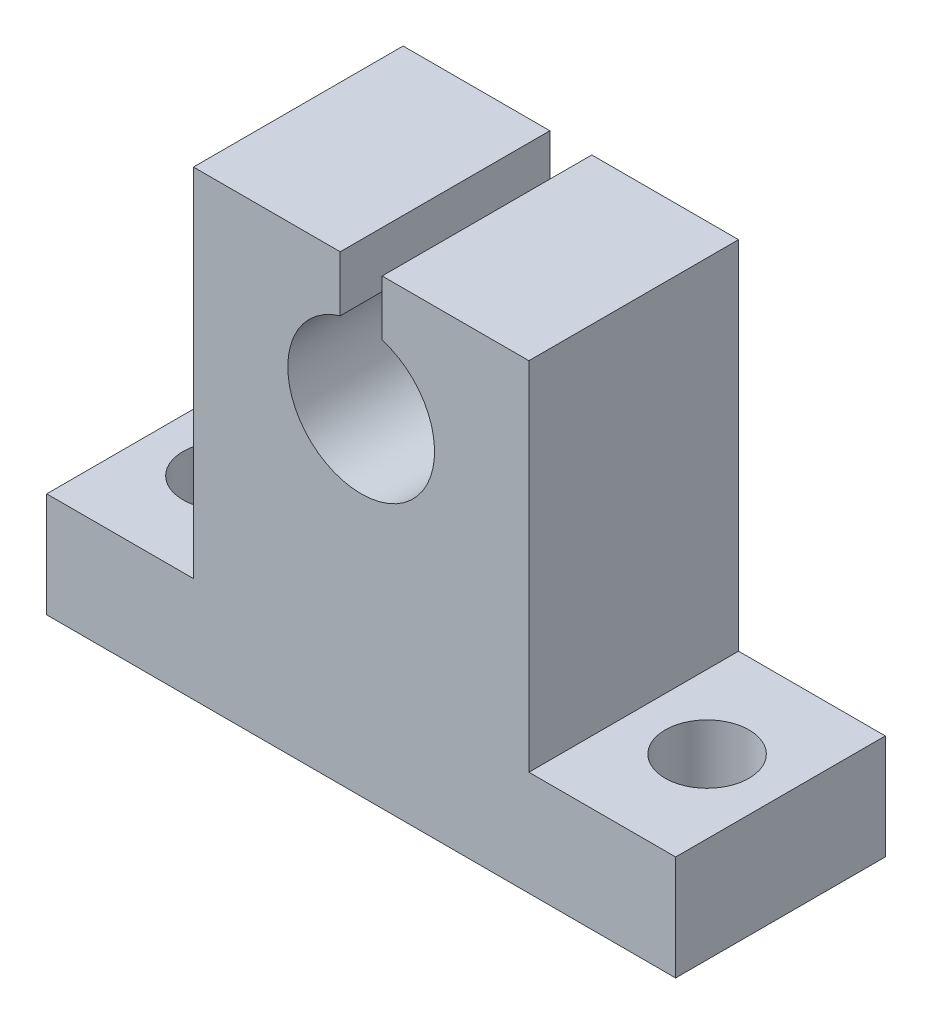
ISO-10303-21;
HEADER;
FILE_DESCRIPTION(('STEP AP214'),'2;1');
FILE_NAME('part.step','',(''),(''),'','','');
FILE_SCHEMA(('AUTOMOTIVE_DESIGN { 1 0 10303 214 1 1 1 1 }'));
ENDSEC;
DATA;
#1=APPLICATION_CONTEXT('core data for automotive mechanical design processes');
#2=APPLICATION_PROTOCOL_DEFINITION('international standard','automotive_design',2000,#1);
#3=PRODUCT_CONTEXT('',#1,'mechanical');
#4=PRODUCT('Part','Part','',(#3));
#5=PRODUCT_RELATED_PRODUCT_CATEGORY('part','',(#4));
#6=PRODUCT_DEFINITION_FORMATION('','',#4);
#7=PRODUCT_DEFINITION_CONTEXT('part definition',#1,'design');
#8=PRODUCT_DEFINITION('design','',#6,#7);
#9=PRODUCT_DEFINITION_SHAPE('','',#8);
#10=(LENGTH_UNIT() NAMED_UNIT(*) SI_UNIT(.MILLI.,.METRE.));
#11=(NAMED_UNIT(*) PLANE_ANGLE_UNIT() SI_UNIT($,.RADIAN.));
#12=(NAMED_UNIT(*) SI_UNIT($,.STERADIAN.) SOLID_ANGLE_UNIT());
#13=UNCERTAINTY_MEASURE_WITH_UNIT(LENGTH_MEASURE(1.E-05),#10,'distance_accuracy_value','');
#14=(GEOMETRIC_REPRESENTATION_CONTEXT(3) GLOBAL_UNCERTAINTY_ASSIGNED_CONTEXT((#13)) GLOBAL_UNIT_ASSIGNED_CONTEXT((#10,
#11,#12)) REPRESENTATION_CONTEXT('',''));
#15=CARTESIAN_POINT('',(0.,0.,0.));
#16=DIRECTION('',(0.,0.,1.));
#17=DIRECTION('',(1.,0.,0.));
#18=AXIS2_PLACEMENT_3D('',#15,#16,#17);
#19=CARTESIAN_POINT('',(-15.,5.,10.));
#20=DIRECTION('',(1.,0.,0.));
#21=DIRECTION('',(0.,0.,-1.));
#22=AXIS2_PLACEMENT_3D('',#19,#20,#21);
#23=PLANE('',#22);
#24=DIRECTION('',(0.,-1.,0.));
#25=VECTOR('',#24,1.);
#26=CARTESIAN_POINT('',(-15.,5.,0.));
#27=LINE('',#26,#25);
#28=CARTESIAN_POINT('',(-15.,5.,0.));
#29=VERTEX_POINT('',#28);
#30=CARTESIAN_POINT('',(-15.,0.,0.));
#31=VERTEX_POINT('',#30);
#32=EDGE_CURVE('E153',#29,#31,#27,.T.);
#33=ORIENTED_EDGE('',*,*,#32,.T.);
#34=DIRECTION('',(0.,0.,-1.));
#35=VECTOR('',#34,1.);
#36=CARTESIAN_POINT('',(-15.,0.,10.));
#37=LINE('',#36,#35);
#38=CARTESIAN_POINT('',(-15.,0.,10.));
#39=VERTEX_POINT('',#38);
#40=EDGE_CURVE('E11',#39,#31,#37,.T.);
#41=ORIENTED_EDGE('',*,*,#40,.F.);
#42=DIRECTION('',(0.,-1.,0.));
#43=VECTOR('',#42,1.);
#44=CARTESIAN_POINT('',(-15.,5.,10.));
#45=LINE('',#44,#43);
#46=CARTESIAN_POINT('',(-15.,5.,10.));
#47=VERTEX_POINT('',#46);
#48=EDGE_CURVE('E176',#47,#39,#45,.T.);
#49=ORIENTED_EDGE('',*,*,#48,.F.);
#50=DIRECTION('',(0.,0.,-1.));
#51=VECTOR('',#50,1.);
#52=CARTESIAN_POINT('',(-15.,5.,10.));
#53=LINE('',#52,#51);
#54=EDGE_CURVE('E149',#47,#29,#53,.T.);
#55=ORIENTED_EDGE('',*,*,#54,.T.);
#56=EDGE_LOOP('',(#33,#41,#49,#55));
#57=FACE_BOUND('',#56,.T.);
#58=ADVANCED_FACE('F33',(#57),#23,.F.);
#59=CARTESIAN_POINT('',(-15.,0.,10.));
#60=DIRECTION('',(0.,1.,0.));
#61=DIRECTION('',(-1.,0.,0.));
#62=AXIS2_PLACEMENT_3D('',#59,#60,#61);
#63=PLANE('',#62);
#64=CARTESIAN_POINT('',(11.5,0.,5.));
#65=DIRECTION('',(0.,1.,0.));
#66=DIRECTION('',(-1.,0.,0.));
#67=AXIS2_PLACEMENT_3D('',#64,#65,#66);
#68=CIRCLE('',#67,2.);
#69=CARTESIAN_POINT('',(9.5,0.,5.));
#70=VERTEX_POINT('',#69);
#71=EDGE_CURVE('E157',#70,#70,#68,.T.);
#72=ORIENTED_EDGE('',*,*,#71,.T.);
#73=EDGE_LOOP('',(#72));
#74=FACE_BOUND('',#73,.T.);
#75=CARTESIAN_POINT('',(-11.5,0.,5.));
#76=DIRECTION('',(0.,1.,0.));
#77=DIRECTION('',(1.,0.,0.));
#78=AXIS2_PLACEMENT_3D('',#75,#76,#77);
#79=CIRCLE('',#78,2.);
#80=CARTESIAN_POINT('',(-9.5,0.,5.));
#81=VERTEX_POINT('',#80);
#82=EDGE_CURVE('E353',#81,#81,#79,.T.);
#83=ORIENTED_EDGE('',*,*,#82,.T.);
#84=EDGE_LOOP('',(#83));
#85=FACE_BOUND('',#84,.T.);
#86=DIRECTION('',(1.,0.,0.));
#87=VECTOR('',#86,1.);
#88=CARTESIAN_POINT('',(-15.,0.,0.));
#89=LINE('',#88,#87);
#90=CARTESIAN_POINT('',(15.,0.,0.));
#91=VERTEX_POINT('',#90);
#92=EDGE_CURVE('E156',#31,#91,#89,.T.);
#93=ORIENTED_EDGE('',*,*,#92,.T.);
#94=DIRECTION('',(0.,0.,-1.));
#95=VECTOR('',#94,1.);
#96=CARTESIAN_POINT('',(15.,0.,10.));
#97=LINE('',#96,#95);
#98=CARTESIAN_POINT('',(15.,0.,10.));
#99=VERTEX_POINT('',#98);
#100=EDGE_CURVE('E41',#99,#91,#97,.T.);
#101=ORIENTED_EDGE('',*,*,#100,.F.);
#102=DIRECTION('',(1.,0.,0.));
#103=VECTOR('',#102,1.);
#104=CARTESIAN_POINT('',(-15.,0.,10.));
#105=LINE('',#104,#103);
#106=EDGE_CURVE('E104',#39,#99,#105,.T.);
#107=ORIENTED_EDGE('',*,*,#106,.F.);
#108=ORIENTED_EDGE('',*,*,#40,.T.);
#109=EDGE_LOOP('',(#93,#101,#107,#108));
#110=FACE_BOUND('',#109,.T.);
#111=ADVANCED_FACE('F256',(#74,#85,#110),#63,.F.);
#112=CARTESIAN_POINT('',(15.,0.,10.));
#113=DIRECTION('',(-1.,0.,0.));
#114=DIRECTION('',(0.,-1.,0.));
#115=AXIS2_PLACEMENT_3D('',#112,#113,#114);
#116=PLANE('',#115);
#117=DIRECTION('',(0.,1.,0.));
#118=VECTOR('',#117,1.);
#119=CARTESIAN_POINT('',(15.,0.,0.));
#120=LINE('',#119,#118);
#121=CARTESIAN_POINT('',(15.,5.00000000000001,0.));
#122=VERTEX_POINT('',#121);
#123=EDGE_CURVE('E159',#91,#122,#120,.T.);
#124=ORIENTED_EDGE('',*,*,#123,.T.);
#125=DIRECTION('',(0.,0.,-1.));
#126=VECTOR('',#125,1.);
#127=CARTESIAN_POINT('',(15.,5.00000000000001,10.));
#128=LINE('',#127,#126);
#129=CARTESIAN_POINT('',(15.,5.00000000000001,10.));
#130=VERTEX_POINT('',#129);
#131=EDGE_CURVE('E195',#130,#122,#128,.T.);
#132=ORIENTED_EDGE('',*,*,#131,.F.);
#133=DIRECTION('',(0.,1.,0.));
#134=VECTOR('',#133,1.);
#135=CARTESIAN_POINT('',(15.,0.,10.));
#136=LINE('',#135,#134);
#137=EDGE_CURVE('E203',#99,#130,#136,.T.);
#138=ORIENTED_EDGE('',*,*,#137,.F.);
#139=ORIENTED_EDGE('',*,*,#100,.T.);
#140=EDGE_LOOP('',(#124,#132,#138,#139));
#141=FACE_BOUND('',#140,.T.);
#142=ADVANCED_FACE('F201',(#141),#116,.F.);
#143=CARTESIAN_POINT('',(15.,5.00000000000001,10.));
#144=DIRECTION('',(0.,-1.,0.));
#145=DIRECTION('',(1.,0.,0.));
#146=AXIS2_PLACEMENT_3D('',#143,#144,#145);
#147=PLANE('',#146);
#148=CARTESIAN_POINT('',(11.5,5.00000000000001,5.));
#149=DIRECTION('',(0.,1.,0.));
#150=DIRECTION('',(-1.,0.,0.));
#151=AXIS2_PLACEMENT_3D('',#148,#149,#150);
#152=CIRCLE('',#151,2.);
#153=CARTESIAN_POINT('',(9.5,5.00000000000001,5.));
#154=VERTEX_POINT('',#153);
#155=EDGE_CURVE('E352',#154,#154,#152,.T.);
#156=ORIENTED_EDGE('',*,*,#155,.F.);
#157=EDGE_LOOP('',(#156));
#158=FACE_BOUND('',#157,.T.);
#159=DIRECTION('',(-1.,0.,0.));
#160=VECTOR('',#159,1.);
#161=CARTESIAN_POINT('',(15.,5.00000000000001,0.));
#162=LINE('',#161,#160);
#163=CARTESIAN_POINT('',(8.,5.00000000000001,0.));
#164=VERTEX_POINT('',#163);
#165=EDGE_CURVE('E161',#122,#164,#162,.T.);
#166=ORIENTED_EDGE('',*,*,#165,.T.);
#167=DIRECTION('',(0.,0.,-1.));
#168=VECTOR('',#167,1.);
#169=CARTESIAN_POINT('',(8.,5.00000000000001,10.));
#170=LINE('',#169,#168);
#171=CARTESIAN_POINT('',(8.,5.00000000000001,10.));
#172=VERTEX_POINT('',#171);
#173=EDGE_CURVE('E192',#172,#164,#170,.T.);
#174=ORIENTED_EDGE('',*,*,#173,.F.);
#175=DIRECTION('',(-1.,0.,0.));
#176=VECTOR('',#175,1.);
#177=CARTESIAN_POINT('',(15.,5.00000000000001,10.));
#178=LINE('',#177,#176);
#179=EDGE_CURVE('E221',#130,#172,#178,.T.);
#180=ORIENTED_EDGE('',*,*,#179,.F.);
#181=ORIENTED_EDGE('',*,*,#131,.T.);
#182=EDGE_LOOP('',(#166,#174,#180,#181));
#183=FACE_BOUND('',#182,.T.);
#184=ADVANCED_FACE('F212',(#158,#183),#147,.F.);
#185=CARTESIAN_POINT('',(8.,5.00000000000001,10.));
#186=DIRECTION('',(-1.,0.,0.));
#187=DIRECTION('',(0.,0.,1.));
#188=AXIS2_PLACEMENT_3D('',#185,#186,#187);
#189=PLANE('',#188);
#190=DIRECTION('',(0.,1.,0.));
#191=VECTOR('',#190,1.);
#192=CARTESIAN_POINT('',(8.,5.00000000000001,0.));
#193=LINE('',#192,#191);
#194=CARTESIAN_POINT('',(8.,22.,0.));
#195=VERTEX_POINT('',#194);
#196=EDGE_CURVE('E163',#164,#195,#193,.T.);
#197=ORIENTED_EDGE('',*,*,#196,.T.);
#198=DIRECTION('',(0.,0.,-1.));
#199=VECTOR('',#198,1.);
#200=CARTESIAN_POINT('',(8.,22.,10.));
#201=LINE('',#200,#199);
#202=CARTESIAN_POINT('',(8.,22.,10.));
#203=VERTEX_POINT('',#202);
#204=EDGE_CURVE('E189',#203,#195,#201,.T.);
#205=ORIENTED_EDGE('',*,*,#204,.F.);
#206=DIRECTION('',(0.,1.,0.));
#207=VECTOR('',#206,1.);
#208=CARTESIAN_POINT('',(8.,5.00000000000001,10.));
#209=LINE('',#208,#207);
#210=EDGE_CURVE('E218',#172,#203,#209,.T.);
#211=ORIENTED_EDGE('',*,*,#210,.F.);
#212=ORIENTED_EDGE('',*,*,#173,.T.);
#213=EDGE_LOOP('',(#197,#205,#211,#212));
#214=FACE_BOUND('',#213,.T.);
#215=ADVANCED_FACE('F216',(#214),#189,.F.);
#216=CARTESIAN_POINT('',(8.,22.,10.));
#217=DIRECTION('',(0.,-1.,0.));
#218=DIRECTION('',(1.,0.,0.));
#219=AXIS2_PLACEMENT_3D('',#216,#217,#218);
#220=PLANE('',#219);
#221=DIRECTION('',(-1.,0.,0.));
#222=VECTOR('',#221,1.);
#223=CARTESIAN_POINT('',(8.,22.,0.));
#224=LINE('',#223,#222);
#225=CARTESIAN_POINT('',(1.,22.,0.));
#226=VERTEX_POINT('',#225);
#227=EDGE_CURVE('E165',#195,#226,#224,.T.);
#228=ORIENTED_EDGE('',*,*,#227,.T.);
#229=DIRECTION('',(0.,0.,-1.));
#230=VECTOR('',#229,1.);
#231=CARTESIAN_POINT('',(1.,22.,10.));
#232=LINE('',#231,#230);
#233=CARTESIAN_POINT('',(1.,22.,10.));
#234=VERTEX_POINT('',#233);
#235=EDGE_CURVE('E186',#234,#226,#232,.T.);
#236=ORIENTED_EDGE('',*,*,#235,.F.);
#237=DIRECTION('',(-1.,0.,0.));
#238=VECTOR('',#237,1.);
#239=CARTESIAN_POINT('',(8.,22.,10.));
#240=LINE('',#239,#238);
#241=EDGE_CURVE('E220',#203,#234,#240,.T.);
#242=ORIENTED_EDGE('',*,*,#241,.F.);
#243=ORIENTED_EDGE('',*,*,#204,.T.);
#244=EDGE_LOOP('',(#228,#236,#242,#243));
#245=FACE_BOUND('',#244,.T.);
#246=ADVANCED_FACE('F273',(#245),#220,.F.);
#247=CARTESIAN_POINT('',(1.,22.,10.));
#248=DIRECTION('',(1.,0.,0.));
#249=DIRECTION('',(0.,1.,0.));
#250=AXIS2_PLACEMENT_3D('',#247,#248,#249);
#251=PLANE('',#250);
#252=DIRECTION('',(0.,-1.,0.));
#253=VECTOR('',#252,1.);
#254=CARTESIAN_POINT('',(1.,22.,0.));
#255=LINE('',#254,#253);
#256=CARTESIAN_POINT('',(1.,19.3541019662497,0.));
#257=VERTEX_POINT('',#256);
#258=EDGE_CURVE('E167',#226,#257,#255,.T.);
#259=ORIENTED_EDGE('',*,*,#258,.T.);
#260=DIRECTION('',(0.,0.,-1.));
#261=VECTOR('',#260,1.);
#262=CARTESIAN_POINT('',(1.,19.3541019662497,10.));
#263=LINE('',#262,#261);
#264=CARTESIAN_POINT('',(1.,19.3541019662497,10.));
#265=VERTEX_POINT('',#264);
#266=EDGE_CURVE('E183',#265,#257,#263,.T.);
#267=ORIENTED_EDGE('',*,*,#266,.F.);
#268=DIRECTION('',(0.,-1.,0.));
#269=VECTOR('',#268,1.);
#270=CARTESIAN_POINT('',(1.,22.,10.));
#271=LINE('',#270,#269);
#272=EDGE_CURVE('E223',#234,#265,#271,.T.);
#273=ORIENTED_EDGE('',*,*,#272,.F.);
#274=ORIENTED_EDGE('',*,*,#235,.T.);
#275=EDGE_LOOP('',(#259,#267,#273,#274));
#276=FACE_BOUND('',#275,.T.);
#277=ADVANCED_FACE('F276',(#276),#251,.F.);
#278=CARTESIAN_POINT('',(0.,16.,10.));
#279=DIRECTION('',(0.,0.,-1.));
#280=DIRECTION('',(-1.,0.,0.));
#281=AXIS2_PLACEMENT_3D('',#278,#279,#280);
#282=CYLINDRICAL_SURFACE('',#281,3.5);
#283=CARTESIAN_POINT('',(0.,16.,0.));
#284=DIRECTION('',(0.,0.,-1.));
#285=DIRECTION('',(1.,0.,0.));
#286=AXIS2_PLACEMENT_3D('',#283,#284,#285);
#287=CIRCLE('',#286,3.5);
#288=CARTESIAN_POINT('',(-1.,19.3541019662497,0.));
#289=VERTEX_POINT('',#288);
#290=EDGE_CURVE('E169',#257,#289,#287,.T.);
#291=ORIENTED_EDGE('',*,*,#290,.T.);
#292=DIRECTION('',(0.,0.,-1.));
#293=VECTOR('',#292,1.);
#294=CARTESIAN_POINT('',(-1.,19.3541019662497,10.));
#295=LINE('',#294,#293);
#296=CARTESIAN_POINT('',(-1.,19.3541019662497,10.));
#297=VERTEX_POINT('',#296);
#298=EDGE_CURVE('E180',#297,#289,#295,.T.);
#299=ORIENTED_EDGE('',*,*,#298,.F.);
#300=CARTESIAN_POINT('',(0.,16.,10.));
#301=DIRECTION('',(0.,0.,-1.));
#302=DIRECTION('',(1.,0.,0.));
#303=AXIS2_PLACEMENT_3D('',#300,#301,#302);
#304=CIRCLE('',#303,3.5);
#305=EDGE_CURVE('E229',#265,#297,#304,.T.);
#306=ORIENTED_EDGE('',*,*,#305,.F.);
#307=ORIENTED_EDGE('',*,*,#266,.T.);
#308=EDGE_LOOP('',(#291,#299,#306,#307));
#309=FACE_BOUND('',#308,.T.);
#310=ADVANCED_FACE('F235',(#309),#282,.F.);
#311=CARTESIAN_POINT('',(-0.999999999999999,22.,10.));
#312=DIRECTION('',(-1.,0.,0.));
#313=DIRECTION('',(0.,-1.,0.));
#314=AXIS2_PLACEMENT_3D('',#311,#312,#313);
#315=PLANE('',#314);
#316=DIRECTION('',(0.,1.,0.));
#317=VECTOR('',#316,1.);
#318=CARTESIAN_POINT('',(-0.999999999999999,22.,0.));
#319=LINE('',#318,#317);
#320=CARTESIAN_POINT('',(-0.999999999999999,22.,0.));
#321=VERTEX_POINT('',#320);
#322=EDGE_CURVE('E171',#289,#321,#319,.T.);
#323=ORIENTED_EDGE('',*,*,#322,.T.);
#324=DIRECTION('',(0.,0.,-1.));
#325=VECTOR('',#324,1.);
#326=CARTESIAN_POINT('',(-0.999999999999999,22.,10.));
#327=LINE('',#326,#325);
#328=CARTESIAN_POINT('',(-0.999999999999999,22.,10.));
#329=VERTEX_POINT('',#328);
#330=EDGE_CURVE('E144',#329,#321,#327,.T.);
#331=ORIENTED_EDGE('',*,*,#330,.F.);
#332=DIRECTION('',(0.,1.,0.));
#333=VECTOR('',#332,1.);
#334=CARTESIAN_POINT('',(-0.999999999999999,22.,10.));
#335=LINE('',#334,#333);
#336=EDGE_CURVE('E135',#297,#329,#335,.T.);
#337=ORIENTED_EDGE('',*,*,#336,.F.);
#338=ORIENTED_EDGE('',*,*,#298,.T.);
#339=EDGE_LOOP('',(#323,#331,#337,#338));
#340=FACE_BOUND('',#339,.T.);
#341=ADVANCED_FACE('F239',(#340),#315,.F.);
#342=CARTESIAN_POINT('',(-0.999999999999999,22.,10.));
#343=DIRECTION('',(0.,-1.,0.));
#344=DIRECTION('',(0.,0.,-1.));
#345=AXIS2_PLACEMENT_3D('',#342,#343,#344);
#346=PLANE('',#345);
#347=DIRECTION('',(-1.,0.,0.));
#348=VECTOR('',#347,1.);
#349=CARTESIAN_POINT('',(-0.999999999999999,22.,0.));
#350=LINE('',#349,#348);
#351=CARTESIAN_POINT('',(-8.,22.,0.));
#352=VERTEX_POINT('',#351);
#353=EDGE_CURVE('E143',#321,#352,#350,.T.);
#354=ORIENTED_EDGE('',*,*,#353,.T.);
#355=DIRECTION('',(0.,0.,-1.));
#356=VECTOR('',#355,1.);
#357=CARTESIAN_POINT('',(-8.,22.,10.));
#358=LINE('',#357,#356);
#359=CARTESIAN_POINT('',(-8.,22.,10.));
#360=VERTEX_POINT('',#359);
#361=EDGE_CURVE('E140',#360,#352,#358,.T.);
#362=ORIENTED_EDGE('',*,*,#361,.F.);
#363=DIRECTION('',(-1.,0.,0.));
#364=VECTOR('',#363,1.);
#365=CARTESIAN_POINT('',(-0.999999999999999,22.,10.));
#366=LINE('',#365,#364);
#367=EDGE_CURVE('E129',#329,#360,#366,.T.);
#368=ORIENTED_EDGE('',*,*,#367,.F.);
#369=ORIENTED_EDGE('',*,*,#330,.T.);
#370=EDGE_LOOP('',(#354,#362,#368,#369));
#371=FACE_BOUND('',#370,.T.);
#372=ADVANCED_FACE('F141',(#371),#346,.F.);
#373=CARTESIAN_POINT('',(-8.,22.,10.));
#374=DIRECTION('',(1.,0.,0.));
#375=DIRECTION('',(0.,1.,0.));
#376=AXIS2_PLACEMENT_3D('',#373,#374,#375);
#377=PLANE('',#376);
#378=DIRECTION('',(0.,-1.,0.));
#379=VECTOR('',#378,1.);
#380=CARTESIAN_POINT('',(-8.,22.,0.));
#381=LINE('',#380,#379);
#382=CARTESIAN_POINT('',(-8.,5.,0.));
#383=VERTEX_POINT('',#382);
#384=EDGE_CURVE('E90',#352,#383,#381,.T.);
#385=ORIENTED_EDGE('',*,*,#384,.T.);
#386=DIRECTION('',(0.,0.,-1.));
#387=VECTOR('',#386,1.);
#388=CARTESIAN_POINT('',(-8.,5.,10.));
#389=LINE('',#388,#387);
#390=CARTESIAN_POINT('',(-8.,5.,10.));
#391=VERTEX_POINT('',#390);
#392=EDGE_CURVE('E145',#391,#383,#389,.T.);
#393=ORIENTED_EDGE('',*,*,#392,.F.);
#394=DIRECTION('',(0.,-1.,0.));
#395=VECTOR('',#394,1.);
#396=CARTESIAN_POINT('',(-8.,22.,10.));
#397=LINE('',#396,#395);
#398=EDGE_CURVE('E133',#360,#391,#397,.T.);
#399=ORIENTED_EDGE('',*,*,#398,.F.);
#400=ORIENTED_EDGE('',*,*,#361,.T.);
#401=EDGE_LOOP('',(#385,#393,#399,#400));
#402=FACE_BOUND('',#401,.T.);
#403=ADVANCED_FACE('F147',(#402),#377,.F.);
#404=CARTESIAN_POINT('',(-8.,5.,10.));
#405=DIRECTION('',(0.,-1.,0.));
#406=DIRECTION('',(1.,0.,0.));
#407=AXIS2_PLACEMENT_3D('',#404,#405,#406);
#408=PLANE('',#407);
#409=CARTESIAN_POINT('',(-11.5,5.,5.));
#410=DIRECTION('',(0.,1.,0.));
#411=DIRECTION('',(1.,0.,0.));
#412=AXIS2_PLACEMENT_3D('',#409,#410,#411);
#413=CIRCLE('',#412,2.);
#414=CARTESIAN_POINT('',(-9.5,5.,5.));
#415=VERTEX_POINT('',#414);
#416=EDGE_CURVE('E357',#415,#415,#413,.T.);
#417=ORIENTED_EDGE('',*,*,#416,.F.);
#418=EDGE_LOOP('',(#417));
#419=FACE_BOUND('',#418,.T.);
#420=DIRECTION('',(-1.,0.,0.));
#421=VECTOR('',#420,1.);
#422=CARTESIAN_POINT('',(-8.,5.,0.));
#423=LINE('',#422,#421);
#424=EDGE_CURVE('E96',#383,#29,#423,.T.);
#425=ORIENTED_EDGE('',*,*,#424,.T.);
#426=ORIENTED_EDGE('',*,*,#54,.F.);
#427=DIRECTION('',(-1.,0.,0.));
#428=VECTOR('',#427,1.);
#429=CARTESIAN_POINT('',(-8.,5.,10.));
#430=LINE('',#429,#428);
#431=EDGE_CURVE('E49',#391,#47,#430,.T.);
#432=ORIENTED_EDGE('',*,*,#431,.F.);
#433=ORIENTED_EDGE('',*,*,#392,.T.);
#434=EDGE_LOOP('',(#425,#426,#432,#433));
#435=FACE_BOUND('',#434,.T.);
#436=ADVANCED_FACE('F243',(#419,#435),#408,.F.);
#437=CARTESIAN_POINT('',(0.,16.,10.));
#438=DIRECTION('',(0.,0.,1.));
#439=DIRECTION('',(1.,0.,0.));
#440=AXIS2_PLACEMENT_3D('',#437,#438,#439);
#441=PLANE('',#440);
#442=ORIENTED_EDGE('',*,*,#48,.T.);
#443=ORIENTED_EDGE('',*,*,#106,.T.);
#444=ORIENTED_EDGE('',*,*,#137,.T.);
#445=ORIENTED_EDGE('',*,*,#179,.T.);
#446=ORIENTED_EDGE('',*,*,#210,.T.);
#447=ORIENTED_EDGE('',*,*,#241,.T.);
#448=ORIENTED_EDGE('',*,*,#272,.T.);
#449=ORIENTED_EDGE('',*,*,#305,.T.);
#450=ORIENTED_EDGE('',*,*,#336,.T.);
#451=ORIENTED_EDGE('',*,*,#367,.T.);
#452=ORIENTED_EDGE('',*,*,#398,.T.);
#453=ORIENTED_EDGE('',*,*,#431,.T.);
#454=EDGE_LOOP('',(#442,#443,#444,#445,#446,#447,#448,#449,#450,#451,#452,#453));
#455=FACE_BOUND('',#454,.T.);
#456=ADVANCED_FACE('F131',(#455),#441,.T.);
#457=CARTESIAN_POINT('',(0.,16.,0.));
#458=DIRECTION('',(0.,0.,1.));
#459=DIRECTION('',(1.,0.,0.));
#460=AXIS2_PLACEMENT_3D('',#457,#458,#459);
#461=PLANE('',#460);
#462=ORIENTED_EDGE('',*,*,#32,.F.);
#463=ORIENTED_EDGE('',*,*,#424,.F.);
#464=ORIENTED_EDGE('',*,*,#384,.F.);
#465=ORIENTED_EDGE('',*,*,#353,.F.);
#466=ORIENTED_EDGE('',*,*,#322,.F.);
#467=ORIENTED_EDGE('',*,*,#290,.F.);
#468=ORIENTED_EDGE('',*,*,#258,.F.);
#469=ORIENTED_EDGE('',*,*,#227,.F.);
#470=ORIENTED_EDGE('',*,*,#196,.F.);
#471=ORIENTED_EDGE('',*,*,#165,.F.);
#472=ORIENTED_EDGE('',*,*,#123,.F.);
#473=ORIENTED_EDGE('',*,*,#92,.F.);
#474=EDGE_LOOP('',(#462,#463,#464,#465,#466,#467,#468,#469,#470,#471,#472,#473));
#475=FACE_BOUND('',#474,.T.);
#476=ADVANCED_FACE('F207',(#475),#461,.F.);
#477=CARTESIAN_POINT('',(-11.5,0.,5.));
#478=DIRECTION('',(0.,1.,0.));
#479=DIRECTION('',(-1.,0.,0.));
#480=AXIS2_PLACEMENT_3D('',#477,#478,#479);
#481=CYLINDRICAL_SURFACE('',#480,2.);
#482=ORIENTED_EDGE('',*,*,#82,.F.);
#483=EDGE_LOOP('',(#482));
#484=FACE_BOUND('',#483,.T.);
#485=ORIENTED_EDGE('',*,*,#416,.T.);
#486=EDGE_LOOP('',(#485));
#487=FACE_BOUND('',#486,.T.);
#488=ADVANCED_FACE('F309',(#484,#487),#481,.F.);
#489=CARTESIAN_POINT('',(11.5,0.,5.));
#490=DIRECTION('',(0.,1.,0.));
#491=DIRECTION('',(-1.,0.,0.));
#492=AXIS2_PLACEMENT_3D('',#489,#490,#491);
#493=CYLINDRICAL_SURFACE('',#492,2.);
#494=ORIENTED_EDGE('',*,*,#71,.F.);
#495=EDGE_LOOP('',(#494));
#496=FACE_BOUND('',#495,.T.);
#497=ORIENTED_EDGE('',*,*,#155,.T.);
#498=EDGE_LOOP('',(#497));
#499=FACE_BOUND('',#498,.T.);
#500=ADVANCED_FACE('F334',(#496,#499),#493,.F.);
#501=CLOSED_SHELL('',(#58,#111,#142,#184,#215,#246,#277,#310,#341,#372,#403,#436,#456,#476,#488,#500));
#502=MANIFOLD_SOLID_BREP('B2',#501);
#503=ADVANCED_BREP_SHAPE_REPRESENTATION('',(#18,#502),#14);
#504=SHAPE_DEFINITION_REPRESENTATION(#9,#503);
ENDSEC;
END-ISO-10303-21;
